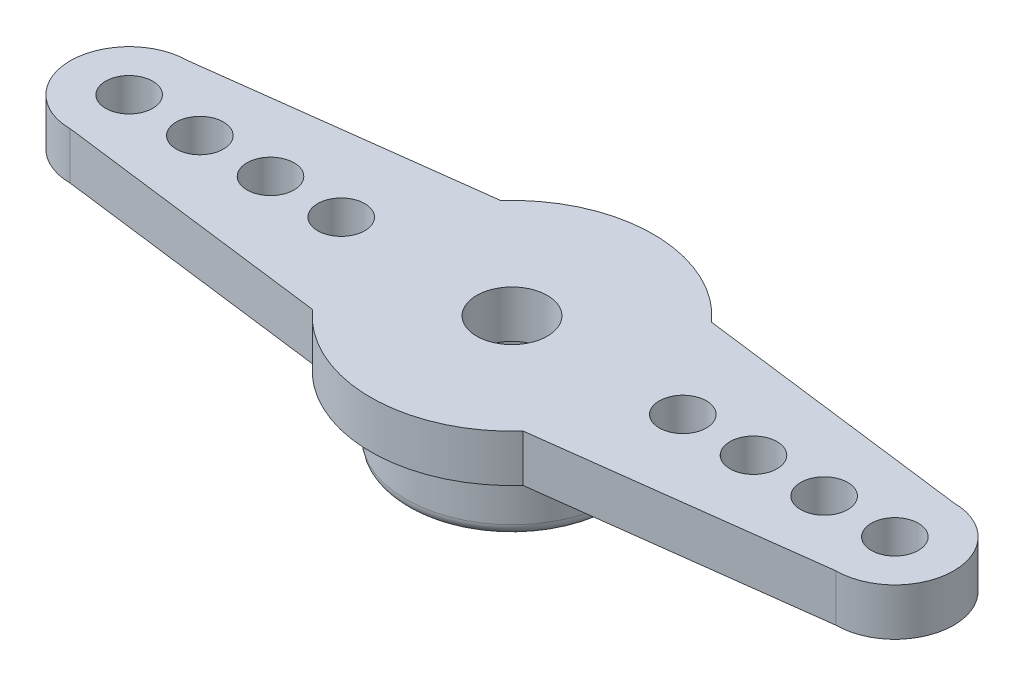
ISO-10303-21;
HEADER;
FILE_DESCRIPTION(('STEP AP214'),'2;1');
FILE_NAME('part.step','',(''),(''),'','','');
FILE_SCHEMA(('AUTOMOTIVE_DESIGN { 1 0 10303 214 1 1 1 1 }'));
ENDSEC;
DATA;
#1=APPLICATION_CONTEXT('core data for automotive mechanical design processes');
#2=APPLICATION_PROTOCOL_DEFINITION('international standard','automotive_design',2000,#1);
#3=PRODUCT_CONTEXT('',#1,'mechanical');
#4=PRODUCT('Part','Part','',(#3));
#5=PRODUCT_RELATED_PRODUCT_CATEGORY('part','',(#4));
#6=PRODUCT_DEFINITION_FORMATION('','',#4);
#7=PRODUCT_DEFINITION_CONTEXT('part definition',#1,'design');
#8=PRODUCT_DEFINITION('design','',#6,#7);
#9=PRODUCT_DEFINITION_SHAPE('','',#8);
#10=(LENGTH_UNIT() NAMED_UNIT(*) SI_UNIT(.MILLI.,.METRE.));
#11=(NAMED_UNIT(*) PLANE_ANGLE_UNIT() SI_UNIT($,.RADIAN.));
#12=(NAMED_UNIT(*) SI_UNIT($,.STERADIAN.) SOLID_ANGLE_UNIT());
#13=UNCERTAINTY_MEASURE_WITH_UNIT(LENGTH_MEASURE(1.E-05),#10,'distance_accuracy_value','');
#14=(GEOMETRIC_REPRESENTATION_CONTEXT(3) GLOBAL_UNCERTAINTY_ASSIGNED_CONTEXT((#13)) GLOBAL_UNIT_ASSIGNED_CONTEXT((#10,
#11,#12)) REPRESENTATION_CONTEXT('',''));
#15=CARTESIAN_POINT('',(0.,0.,0.));
#16=DIRECTION('',(0.,0.,1.));
#17=DIRECTION('',(1.,0.,0.));
#18=AXIS2_PLACEMENT_3D('',#15,#16,#17);
#19=CARTESIAN_POINT('',(0.,0.,0.));
#20=DIRECTION('',(0.,1.,0.));
#21=DIRECTION('',(0.,0.,1.));
#22=AXIS2_PLACEMENT_3D('',#19,#20,#21);
#23=PLANE('',#22);
#24=CARTESIAN_POINT('',(0.,0.,0.));
#25=DIRECTION('',(0.,1.,0.));
#26=DIRECTION('',(0.,0.,1.));
#27=AXIS2_PLACEMENT_3D('',#24,#25,#26);
#28=CIRCLE('',#27,1.5);
#29=CARTESIAN_POINT('',(0.,0.,1.5));
#30=VERTEX_POINT('',#29);
#31=EDGE_CURVE('E237',#30,#30,#28,.T.);
#32=ORIENTED_EDGE('',*,*,#31,.T.);
#33=EDGE_LOOP('',(#32));
#34=FACE_BOUND('',#33,.T.);
#35=CARTESIAN_POINT('',(0.,0.,0.));
#36=DIRECTION('',(0.,-1.,0.));
#37=DIRECTION('',(0.,0.,-1.));
#38=AXIS2_PLACEMENT_3D('',#35,#36,#37);
#39=CIRCLE('',#38,3.17956091615097);
#40=CARTESIAN_POINT('',(0.,0.,-3.17956091615097));
#41=VERTEX_POINT('',#40);
#42=EDGE_CURVE('E457',#41,#41,#39,.T.);
#43=ORIENTED_EDGE('',*,*,#42,.T.);
#44=EDGE_LOOP('',(#43));
#45=FACE_BOUND('',#44,.T.);
#46=ADVANCED_FACE('F33',(#34,#45),#23,.F.);
#47=CARTESIAN_POINT('',(0.,2.,0.));
#48=DIRECTION('',(0.,1.,0.));
#49=DIRECTION('',(0.,0.,1.));
#50=AXIS2_PLACEMENT_3D('',#47,#48,#49);
#51=PLANE('',#50);
#52=CARTESIAN_POINT('',(-7.25,2.,0.));
#53=DIRECTION('',(0.,1.,0.));
#54=DIRECTION('',(0.,0.,1.));
#55=AXIS2_PLACEMENT_3D('',#52,#53,#54);
#56=CIRCLE('',#55,1.);
#57=CARTESIAN_POINT('',(-7.25,2.,1.));
#58=VERTEX_POINT('',#57);
#59=EDGE_CURVE('E249',#58,#58,#56,.T.);
#60=ORIENTED_EDGE('',*,*,#59,.F.);
#61=EDGE_LOOP('',(#60));
#62=FACE_BOUND('',#61,.T.);
#63=CARTESIAN_POINT('',(0.,2.,0.));
#64=DIRECTION('',(0.,1.,0.));
#65=DIRECTION('',(0.,0.,1.));
#66=AXIS2_PLACEMENT_3D('',#63,#64,#65);
#67=CIRCLE('',#66,1.5);
#68=CARTESIAN_POINT('',(0.,2.,1.5));
#69=VERTEX_POINT('',#68);
#70=EDGE_CURVE('E479',#69,#69,#67,.T.);
#71=ORIENTED_EDGE('',*,*,#70,.F.);
#72=EDGE_LOOP('',(#71));
#73=FACE_BOUND('',#72,.T.);
#74=CARTESIAN_POINT('',(16.25,2.,0.));
#75=DIRECTION('',(0.,1.,0.));
#76=DIRECTION('',(0.,0.,1.));
#77=AXIS2_PLACEMENT_3D('',#74,#75,#76);
#78=CIRCLE('',#77,1.);
#79=CARTESIAN_POINT('',(16.25,2.,1.00000000000001));
#80=VERTEX_POINT('',#79);
#81=EDGE_CURVE('E234',#80,#80,#78,.F.);
#82=ORIENTED_EDGE('',*,*,#81,.T.);
#83=EDGE_LOOP('',(#82));
#84=FACE_BOUND('',#83,.T.);
#85=CARTESIAN_POINT('',(10.25,2.,0.));
#86=DIRECTION('',(0.,1.,0.));
#87=DIRECTION('',(0.,0.,1.));
#88=AXIS2_PLACEMENT_3D('',#85,#86,#87);
#89=CIRCLE('',#88,1.);
#90=CARTESIAN_POINT('',(10.25,2.,1.00000000000001));
#91=VERTEX_POINT('',#90);
#92=EDGE_CURVE('E244',#91,#91,#89,.F.);
#93=ORIENTED_EDGE('',*,*,#92,.T.);
#94=EDGE_LOOP('',(#93));
#95=FACE_BOUND('',#94,.T.);
#96=CARTESIAN_POINT('',(-10.25,2.,0.));
#97=DIRECTION('',(0.,1.,0.));
#98=DIRECTION('',(0.,0.,1.));
#99=AXIS2_PLACEMENT_3D('',#96,#97,#98);
#100=CIRCLE('',#99,1.);
#101=CARTESIAN_POINT('',(-10.25,2.,1.));
#102=VERTEX_POINT('',#101);
#103=EDGE_CURVE('E246',#102,#102,#100,.T.);
#104=ORIENTED_EDGE('',*,*,#103,.F.);
#105=EDGE_LOOP('',(#104));
#106=FACE_BOUND('',#105,.T.);
#107=CARTESIAN_POINT('',(0.,2.,0.));
#108=DIRECTION('',(0.,1.,0.));
#109=DIRECTION('',(0.,0.,1.));
#110=AXIS2_PLACEMENT_3D('',#107,#108,#109);
#111=CIRCLE('',#110,6.);
#112=CARTESIAN_POINT('',(4.47213595499958,2.,-4.));
#113=VERTEX_POINT('',#112);
#114=CARTESIAN_POINT('',(-4.47213595499958,2.,-4.));
#115=VERTEX_POINT('',#114);
#116=EDGE_CURVE('E147',#113,#115,#111,.T.);
#117=ORIENTED_EDGE('',*,*,#116,.T.);
#118=DIRECTION('',(-0.991987368893752,0.,0.126337088597339));
#119=VECTOR('',#118,1.);
#120=CARTESIAN_POINT('',(-16.25,2.,-2.5));
#121=LINE('',#120,#119);
#122=CARTESIAN_POINT('',(-16.25,2.,-2.5));
#123=VERTEX_POINT('',#122);
#124=EDGE_CURVE('E94',#115,#123,#121,.T.);
#125=ORIENTED_EDGE('',*,*,#124,.T.);
#126=CARTESIAN_POINT('',(-16.25,2.,0.));
#127=DIRECTION('',(0.,1.,0.));
#128=DIRECTION('',(0.,0.,1.));
#129=AXIS2_PLACEMENT_3D('',#126,#127,#128);
#130=CIRCLE('',#129,2.5);
#131=CARTESIAN_POINT('',(-16.25,2.,2.5));
#132=VERTEX_POINT('',#131);
#133=EDGE_CURVE('E252',#123,#132,#130,.T.);
#134=ORIENTED_EDGE('',*,*,#133,.T.);
#135=DIRECTION('',(0.991987368893752,0.,0.126337088597339));
#136=VECTOR('',#135,1.);
#137=CARTESIAN_POINT('',(-16.25,2.,2.5));
#138=LINE('',#137,#136);
#139=CARTESIAN_POINT('',(-4.47213595499958,2.,4.));
#140=VERTEX_POINT('',#139);
#141=EDGE_CURVE('E254',#132,#140,#138,.T.);
#142=ORIENTED_EDGE('',*,*,#141,.T.);
#143=CARTESIAN_POINT('',(0.,2.,0.));
#144=DIRECTION('',(0.,1.,0.));
#145=DIRECTION('',(0.,0.,1.));
#146=AXIS2_PLACEMENT_3D('',#143,#144,#145);
#147=CIRCLE('',#146,6.);
#148=CARTESIAN_POINT('',(4.47213595499958,2.,4.));
#149=VERTEX_POINT('',#148);
#150=EDGE_CURVE('E114',#140,#149,#147,.T.);
#151=ORIENTED_EDGE('',*,*,#150,.T.);
#152=DIRECTION('',(0.991987368893752,0.,-0.126337088597339));
#153=VECTOR('',#152,1.);
#154=CARTESIAN_POINT('',(4.47213595499958,2.,4.));
#155=LINE('',#154,#153);
#156=CARTESIAN_POINT('',(16.25,2.,2.5));
#157=VERTEX_POINT('',#156);
#158=EDGE_CURVE('E107',#149,#157,#155,.T.);
#159=ORIENTED_EDGE('',*,*,#158,.T.);
#160=CARTESIAN_POINT('',(16.25,2.,0.));
#161=DIRECTION('',(0.,1.,0.));
#162=DIRECTION('',(0.,0.,1.));
#163=AXIS2_PLACEMENT_3D('',#160,#161,#162);
#164=CIRCLE('',#163,2.5);
#165=CARTESIAN_POINT('',(16.25,2.,-2.5));
#166=VERTEX_POINT('',#165);
#167=EDGE_CURVE('E112',#157,#166,#164,.T.);
#168=ORIENTED_EDGE('',*,*,#167,.T.);
#169=DIRECTION('',(-0.991987368893752,0.,-0.126337088597339));
#170=VECTOR('',#169,1.);
#171=CARTESIAN_POINT('',(4.47213595499958,2.,-4.));
#172=LINE('',#171,#170);
#173=EDGE_CURVE('E50',#166,#113,#172,.T.);
#174=ORIENTED_EDGE('',*,*,#173,.T.);
#175=EDGE_LOOP('',(#117,#125,#134,#142,#151,#159,#168,#174));
#176=FACE_BOUND('',#175,.T.);
#177=CARTESIAN_POINT('',(-16.25,2.,0.));
#178=DIRECTION('',(0.,1.,0.));
#179=DIRECTION('',(0.,0.,1.));
#180=AXIS2_PLACEMENT_3D('',#177,#178,#179);
#181=CIRCLE('',#180,1.);
#182=CARTESIAN_POINT('',(-16.25,2.,1.));
#183=VERTEX_POINT('',#182);
#184=EDGE_CURVE('E472',#183,#183,#181,.T.);
#185=ORIENTED_EDGE('',*,*,#184,.F.);
#186=EDGE_LOOP('',(#185));
#187=FACE_BOUND('',#186,.T.);
#188=CARTESIAN_POINT('',(-13.25,2.,0.));
#189=DIRECTION('',(0.,1.,0.));
#190=DIRECTION('',(0.,0.,1.));
#191=AXIS2_PLACEMENT_3D('',#188,#189,#190);
#192=CIRCLE('',#191,1.);
#193=CARTESIAN_POINT('',(-13.25,2.,1.));
#194=VERTEX_POINT('',#193);
#195=EDGE_CURVE('E461',#194,#194,#192,.T.);
#196=ORIENTED_EDGE('',*,*,#195,.F.);
#197=EDGE_LOOP('',(#196));
#198=FACE_BOUND('',#197,.T.);
#199=CARTESIAN_POINT('',(7.25,2.,0.));
#200=DIRECTION('',(0.,-1.,0.));
#201=DIRECTION('',(0.,0.,-1.));
#202=AXIS2_PLACEMENT_3D('',#199,#200,#201);
#203=CIRCLE('',#202,1.);
#204=CARTESIAN_POINT('',(7.25,2.,-0.999999999999997));
#205=VERTEX_POINT('',#204);
#206=EDGE_CURVE('E465',#205,#205,#203,.T.);
#207=ORIENTED_EDGE('',*,*,#206,.T.);
#208=EDGE_LOOP('',(#207));
#209=FACE_BOUND('',#208,.T.);
#210=CARTESIAN_POINT('',(13.25,2.,0.));
#211=DIRECTION('',(0.,1.,0.));
#212=DIRECTION('',(0.,0.,1.));
#213=AXIS2_PLACEMENT_3D('',#210,#211,#212);
#214=CIRCLE('',#213,1.);
#215=CARTESIAN_POINT('',(13.25,2.,1.00000000000001));
#216=VERTEX_POINT('',#215);
#217=EDGE_CURVE('E233',#216,#216,#214,.F.);
#218=ORIENTED_EDGE('',*,*,#217,.T.);
#219=EDGE_LOOP('',(#218));
#220=FACE_BOUND('',#219,.T.);
#221=ADVANCED_FACE('F109',(#62,#73,#84,#95,#106,#176,#187,#198,#209,#220),#51,.T.);
#222=CARTESIAN_POINT('',(0.,0.,0.));
#223=DIRECTION('',(0.,1.,0.));
#224=DIRECTION('',(0.,0.,1.));
#225=AXIS2_PLACEMENT_3D('',#222,#223,#224);
#226=CIRCLE('',#225,4.5);
#227=CARTESIAN_POINT('',(0.,0.,4.5));
#228=VERTEX_POINT('',#227);
#229=EDGE_CURVE('E162',#228,#228,#226,.F.);
#230=ORIENTED_EDGE('',*,*,#229,.F.);
#231=EDGE_LOOP('',(#230));
#232=FACE_BOUND('',#231,.T.);
#233=CARTESIAN_POINT('',(-7.25,0.,0.));
#234=DIRECTION('',(0.,1.,0.));
#235=DIRECTION('',(0.,0.,1.));
#236=AXIS2_PLACEMENT_3D('',#233,#234,#235);
#237=CIRCLE('',#236,1.);
#238=CARTESIAN_POINT('',(-7.25,0.,1.));
#239=VERTEX_POINT('',#238);
#240=EDGE_CURVE('E203',#239,#239,#237,.T.);
#241=ORIENTED_EDGE('',*,*,#240,.T.);
#242=EDGE_LOOP('',(#241));
#243=FACE_BOUND('',#242,.T.);
#244=CARTESIAN_POINT('',(-13.25,0.,0.));
#245=DIRECTION('',(0.,1.,0.));
#246=DIRECTION('',(0.,0.,1.));
#247=AXIS2_PLACEMENT_3D('',#244,#245,#246);
#248=CIRCLE('',#247,1.);
#249=CARTESIAN_POINT('',(-13.25,0.,1.));
#250=VERTEX_POINT('',#249);
#251=EDGE_CURVE('E207',#250,#250,#248,.T.);
#252=ORIENTED_EDGE('',*,*,#251,.T.);
#253=EDGE_LOOP('',(#252));
#254=FACE_BOUND('',#253,.T.);
#255=CARTESIAN_POINT('',(-16.25,0.,0.));
#256=DIRECTION('',(0.,1.,0.));
#257=DIRECTION('',(0.,0.,1.));
#258=AXIS2_PLACEMENT_3D('',#255,#256,#257);
#259=CIRCLE('',#258,1.);
#260=CARTESIAN_POINT('',(-16.25,0.,1.));
#261=VERTEX_POINT('',#260);
#262=EDGE_CURVE('E211',#261,#261,#259,.T.);
#263=ORIENTED_EDGE('',*,*,#262,.T.);
#264=EDGE_LOOP('',(#263));
#265=FACE_BOUND('',#264,.T.);
#266=CARTESIAN_POINT('',(-10.25,0.,0.));
#267=DIRECTION('',(0.,1.,0.));
#268=DIRECTION('',(0.,0.,1.));
#269=AXIS2_PLACEMENT_3D('',#266,#267,#268);
#270=CIRCLE('',#269,1.);
#271=CARTESIAN_POINT('',(-10.25,0.,1.));
#272=VERTEX_POINT('',#271);
#273=EDGE_CURVE('E136',#272,#272,#270,.T.);
#274=ORIENTED_EDGE('',*,*,#273,.T.);
#275=EDGE_LOOP('',(#274));
#276=FACE_BOUND('',#275,.T.);
#277=CARTESIAN_POINT('',(0.,0.,0.));
#278=DIRECTION('',(0.,1.,0.));
#279=DIRECTION('',(0.,0.,1.));
#280=AXIS2_PLACEMENT_3D('',#277,#278,#279);
#281=CIRCLE('',#280,6.);
#282=CARTESIAN_POINT('',(4.47213595499958,0.,-4.));
#283=VERTEX_POINT('',#282);
#284=CARTESIAN_POINT('',(-4.47213595499958,0.,-4.));
#285=VERTEX_POINT('',#284);
#286=EDGE_CURVE('E132',#283,#285,#281,.T.);
#287=ORIENTED_EDGE('',*,*,#286,.F.);
#288=DIRECTION('',(-0.991987368893752,0.,-0.126337088597339));
#289=VECTOR('',#288,1.);
#290=CARTESIAN_POINT('',(4.47213595499958,0.,-4.));
#291=LINE('',#290,#289);
#292=CARTESIAN_POINT('',(16.25,0.,-2.5));
#293=VERTEX_POINT('',#292);
#294=EDGE_CURVE('E85',#293,#283,#291,.T.);
#295=ORIENTED_EDGE('',*,*,#294,.F.);
#296=CARTESIAN_POINT('',(16.25,0.,0.));
#297=DIRECTION('',(0.,1.,0.));
#298=DIRECTION('',(0.,0.,1.));
#299=AXIS2_PLACEMENT_3D('',#296,#297,#298);
#300=CIRCLE('',#299,2.5);
#301=CARTESIAN_POINT('',(16.25,0.,2.5));
#302=VERTEX_POINT('',#301);
#303=EDGE_CURVE('E79',#302,#293,#300,.T.);
#304=ORIENTED_EDGE('',*,*,#303,.F.);
#305=DIRECTION('',(0.991987368893752,0.,-0.126337088597339));
#306=VECTOR('',#305,1.);
#307=CARTESIAN_POINT('',(4.47213595499958,0.,4.));
#308=LINE('',#307,#306);
#309=CARTESIAN_POINT('',(4.47213595499958,0.,4.));
#310=VERTEX_POINT('',#309);
#311=EDGE_CURVE('E122',#310,#302,#308,.T.);
#312=ORIENTED_EDGE('',*,*,#311,.F.);
#313=CARTESIAN_POINT('',(0.,0.,0.));
#314=DIRECTION('',(0.,1.,0.));
#315=DIRECTION('',(0.,0.,1.));
#316=AXIS2_PLACEMENT_3D('',#313,#314,#315);
#317=CIRCLE('',#316,6.);
#318=CARTESIAN_POINT('',(-4.47213595499958,0.,4.));
#319=VERTEX_POINT('',#318);
#320=EDGE_CURVE('E142',#319,#310,#317,.T.);
#321=ORIENTED_EDGE('',*,*,#320,.F.);
#322=DIRECTION('',(0.991987368893752,0.,0.126337088597339));
#323=VECTOR('',#322,1.);
#324=CARTESIAN_POINT('',(-16.25,0.,2.5));
#325=LINE('',#324,#323);
#326=CARTESIAN_POINT('',(-16.25,0.,2.5));
#327=VERTEX_POINT('',#326);
#328=EDGE_CURVE('E140',#327,#319,#325,.T.);
#329=ORIENTED_EDGE('',*,*,#328,.F.);
#330=CARTESIAN_POINT('',(-16.25,0.,0.));
#331=DIRECTION('',(0.,1.,0.));
#332=DIRECTION('',(0.,0.,1.));
#333=AXIS2_PLACEMENT_3D('',#330,#331,#332);
#334=CIRCLE('',#333,2.5);
#335=CARTESIAN_POINT('',(-16.25,0.,-2.5));
#336=VERTEX_POINT('',#335);
#337=EDGE_CURVE('E138',#336,#327,#334,.T.);
#338=ORIENTED_EDGE('',*,*,#337,.F.);
#339=DIRECTION('',(-0.991987368893752,0.,0.126337088597339));
#340=VECTOR('',#339,1.);
#341=CARTESIAN_POINT('',(-16.25,0.,-2.5));
#342=LINE('',#341,#340);
#343=EDGE_CURVE('E135',#285,#336,#342,.T.);
#344=ORIENTED_EDGE('',*,*,#343,.F.);
#345=EDGE_LOOP('',(#287,#295,#304,#312,#321,#329,#338,#344));
#346=FACE_BOUND('',#345,.T.);
#347=CARTESIAN_POINT('',(10.25,0.,0.));
#348=DIRECTION('',(0.,1.,0.));
#349=DIRECTION('',(0.,0.,1.));
#350=AXIS2_PLACEMENT_3D('',#347,#348,#349);
#351=CIRCLE('',#350,1.);
#352=CARTESIAN_POINT('',(10.25,0.,1.00000000000001));
#353=VERTEX_POINT('',#352);
#354=EDGE_CURVE('E220',#353,#353,#351,.F.);
#355=ORIENTED_EDGE('',*,*,#354,.F.);
#356=EDGE_LOOP('',(#355));
#357=FACE_BOUND('',#356,.T.);
#358=CARTESIAN_POINT('',(7.25,0.,0.));
#359=DIRECTION('',(0.,-1.,0.));
#360=DIRECTION('',(0.,0.,-1.));
#361=AXIS2_PLACEMENT_3D('',#358,#359,#360);
#362=CIRCLE('',#361,1.);
#363=CARTESIAN_POINT('',(7.25,0.,-0.999999999999997));
#364=VERTEX_POINT('',#363);
#365=EDGE_CURVE('E224',#364,#364,#362,.T.);
#366=ORIENTED_EDGE('',*,*,#365,.F.);
#367=EDGE_LOOP('',(#366));
#368=FACE_BOUND('',#367,.T.);
#369=CARTESIAN_POINT('',(16.25,0.,0.));
#370=DIRECTION('',(0.,1.,0.));
#371=DIRECTION('',(0.,0.,1.));
#372=AXIS2_PLACEMENT_3D('',#369,#370,#371);
#373=CIRCLE('',#372,1.);
#374=CARTESIAN_POINT('',(16.25,0.,1.00000000000001));
#375=VERTEX_POINT('',#374);
#376=EDGE_CURVE('E228',#375,#375,#373,.F.);
#377=ORIENTED_EDGE('',*,*,#376,.F.);
#378=EDGE_LOOP('',(#377));
#379=FACE_BOUND('',#378,.T.);
#380=CARTESIAN_POINT('',(13.25,0.,0.));
#381=DIRECTION('',(0.,1.,0.));
#382=DIRECTION('',(0.,0.,1.));
#383=AXIS2_PLACEMENT_3D('',#380,#381,#382);
#384=CIRCLE('',#383,1.);
#385=CARTESIAN_POINT('',(13.25,0.,1.00000000000001));
#386=VERTEX_POINT('',#385);
#387=EDGE_CURVE('E231',#386,#386,#384,.F.);
#388=ORIENTED_EDGE('',*,*,#387,.F.);
#389=EDGE_LOOP('',(#388));
#390=FACE_BOUND('',#389,.T.);
#391=ADVANCED_FACE('F181',(#232,#243,#254,#265,#276,#346,#357,#368,#379,#390),#23,.F.);
#392=CARTESIAN_POINT('',(0.,2.,0.));
#393=DIRECTION('',(0.,-1.,0.));
#394=DIRECTION('',(0.,0.,-1.));
#395=AXIS2_PLACEMENT_3D('',#392,#393,#394);
#396=CYLINDRICAL_SURFACE('',#395,6.);
#397=ORIENTED_EDGE('',*,*,#286,.T.);
#398=DIRECTION('',(0.,-1.,0.));
#399=VECTOR('',#398,1.);
#400=CARTESIAN_POINT('',(-4.47213595499958,2.,-4.));
#401=LINE('',#400,#399);
#402=EDGE_CURVE('E160',#115,#285,#401,.T.);
#403=ORIENTED_EDGE('',*,*,#402,.F.);
#404=ORIENTED_EDGE('',*,*,#116,.F.);
#405=DIRECTION('',(0.,-1.,0.));
#406=VECTOR('',#405,1.);
#407=CARTESIAN_POINT('',(4.47213595499958,2.,-4.));
#408=LINE('',#407,#406);
#409=EDGE_CURVE('E128',#113,#283,#408,.T.);
#410=ORIENTED_EDGE('',*,*,#409,.T.);
#411=EDGE_LOOP('',(#397,#403,#404,#410));
#412=FACE_BOUND('',#411,.T.);
#413=ADVANCED_FACE('F191',(#412),#396,.T.);
#414=CARTESIAN_POINT('',(-16.25,2.,-2.5));
#415=DIRECTION('',(0.126337088597339,0.,0.991987368893752));
#416=DIRECTION('',(0.991987368893752,0.,-0.126337088597339));
#417=AXIS2_PLACEMENT_3D('',#414,#415,#416);
#418=PLANE('',#417);
#419=ORIENTED_EDGE('',*,*,#343,.T.);
#420=DIRECTION('',(0.,-1.,0.));
#421=VECTOR('',#420,1.);
#422=CARTESIAN_POINT('',(-16.25,2.,-2.5));
#423=LINE('',#422,#421);
#424=EDGE_CURVE('E157',#123,#336,#423,.T.);
#425=ORIENTED_EDGE('',*,*,#424,.F.);
#426=ORIENTED_EDGE('',*,*,#124,.F.);
#427=ORIENTED_EDGE('',*,*,#402,.T.);
#428=EDGE_LOOP('',(#419,#425,#426,#427));
#429=FACE_BOUND('',#428,.T.);
#430=ADVANCED_FACE('F196',(#429),#418,.F.);
#431=CARTESIAN_POINT('',(-16.25,2.,0.));
#432=DIRECTION('',(0.,-1.,0.));
#433=DIRECTION('',(0.,0.,-1.));
#434=AXIS2_PLACEMENT_3D('',#431,#432,#433);
#435=CYLINDRICAL_SURFACE('',#434,2.5);
#436=ORIENTED_EDGE('',*,*,#337,.T.);
#437=DIRECTION('',(0.,-1.,0.));
#438=VECTOR('',#437,1.);
#439=CARTESIAN_POINT('',(-16.25,2.,2.5));
#440=LINE('',#439,#438);
#441=EDGE_CURVE('E154',#132,#327,#440,.T.);
#442=ORIENTED_EDGE('',*,*,#441,.F.);
#443=ORIENTED_EDGE('',*,*,#133,.F.);
#444=ORIENTED_EDGE('',*,*,#424,.T.);
#445=EDGE_LOOP('',(#436,#442,#443,#444));
#446=FACE_BOUND('',#445,.T.);
#447=ADVANCED_FACE('F267',(#446),#435,.T.);
#448=CARTESIAN_POINT('',(-16.25,2.,2.5));
#449=DIRECTION('',(0.126337088597339,0.,-0.991987368893752));
#450=DIRECTION('',(-0.991987368893752,0.,-0.126337088597339));
#451=AXIS2_PLACEMENT_3D('',#448,#449,#450);
#452=PLANE('',#451);
#453=ORIENTED_EDGE('',*,*,#328,.T.);
#454=DIRECTION('',(0.,-1.,0.));
#455=VECTOR('',#454,1.);
#456=CARTESIAN_POINT('',(-4.47213595499958,2.,4.));
#457=LINE('',#456,#455);
#458=EDGE_CURVE('E151',#140,#319,#457,.T.);
#459=ORIENTED_EDGE('',*,*,#458,.F.);
#460=ORIENTED_EDGE('',*,*,#141,.F.);
#461=ORIENTED_EDGE('',*,*,#441,.T.);
#462=EDGE_LOOP('',(#453,#459,#460,#461));
#463=FACE_BOUND('',#462,.T.);
#464=ADVANCED_FACE('F260',(#463),#452,.F.);
#465=CARTESIAN_POINT('',(0.,2.,0.));
#466=DIRECTION('',(0.,-1.,0.));
#467=DIRECTION('',(0.,0.,-1.));
#468=AXIS2_PLACEMENT_3D('',#465,#466,#467);
#469=CYLINDRICAL_SURFACE('',#468,6.);
#470=ORIENTED_EDGE('',*,*,#320,.T.);
#471=DIRECTION('',(0.,-1.,0.));
#472=VECTOR('',#471,1.);
#473=CARTESIAN_POINT('',(4.47213595499958,2.,4.));
#474=LINE('',#473,#472);
#475=EDGE_CURVE('E123',#149,#310,#474,.T.);
#476=ORIENTED_EDGE('',*,*,#475,.F.);
#477=ORIENTED_EDGE('',*,*,#150,.F.);
#478=ORIENTED_EDGE('',*,*,#458,.T.);
#479=EDGE_LOOP('',(#470,#476,#477,#478));
#480=FACE_BOUND('',#479,.T.);
#481=ADVANCED_FACE('F264',(#480),#469,.T.);
#482=CARTESIAN_POINT('',(4.47213595499958,2.,4.));
#483=DIRECTION('',(-0.126337088597339,0.,-0.991987368893752));
#484=DIRECTION('',(-0.991987368893752,0.,0.126337088597339));
#485=AXIS2_PLACEMENT_3D('',#482,#483,#484);
#486=PLANE('',#485);
#487=ORIENTED_EDGE('',*,*,#311,.T.);
#488=DIRECTION('',(0.,-1.,0.));
#489=VECTOR('',#488,1.);
#490=CARTESIAN_POINT('',(16.25,2.,2.5));
#491=LINE('',#490,#489);
#492=EDGE_CURVE('E119',#157,#302,#491,.T.);
#493=ORIENTED_EDGE('',*,*,#492,.F.);
#494=ORIENTED_EDGE('',*,*,#158,.F.);
#495=ORIENTED_EDGE('',*,*,#475,.T.);
#496=EDGE_LOOP('',(#487,#493,#494,#495));
#497=FACE_BOUND('',#496,.T.);
#498=ADVANCED_FACE('F120',(#497),#486,.F.);
#499=CARTESIAN_POINT('',(16.25,2.,0.));
#500=DIRECTION('',(0.,-1.,0.));
#501=DIRECTION('',(0.,0.,-1.));
#502=AXIS2_PLACEMENT_3D('',#499,#500,#501);
#503=CYLINDRICAL_SURFACE('',#502,2.5);
#504=ORIENTED_EDGE('',*,*,#303,.T.);
#505=DIRECTION('',(0.,-1.,0.));
#506=VECTOR('',#505,1.);
#507=CARTESIAN_POINT('',(16.25,2.,-2.5));
#508=LINE('',#507,#506);
#509=EDGE_CURVE('E124',#166,#293,#508,.T.);
#510=ORIENTED_EDGE('',*,*,#509,.F.);
#511=ORIENTED_EDGE('',*,*,#167,.F.);
#512=ORIENTED_EDGE('',*,*,#492,.T.);
#513=EDGE_LOOP('',(#504,#510,#511,#512));
#514=FACE_BOUND('',#513,.T.);
#515=ADVANCED_FACE('F126',(#514),#503,.T.);
#516=CARTESIAN_POINT('',(4.47213595499958,2.,-4.));
#517=DIRECTION('',(-0.126337088597339,0.,0.991987368893752));
#518=DIRECTION('',(0.991987368893752,0.,0.126337088597339));
#519=AXIS2_PLACEMENT_3D('',#516,#517,#518);
#520=PLANE('',#519);
#521=ORIENTED_EDGE('',*,*,#294,.T.);
#522=ORIENTED_EDGE('',*,*,#409,.F.);
#523=ORIENTED_EDGE('',*,*,#173,.F.);
#524=ORIENTED_EDGE('',*,*,#509,.T.);
#525=EDGE_LOOP('',(#521,#522,#523,#524));
#526=FACE_BOUND('',#525,.T.);
#527=ADVANCED_FACE('F270',(#526),#520,.F.);
#528=CARTESIAN_POINT('',(-10.25,0.,0.));
#529=DIRECTION('',(0.,1.,0.));
#530=DIRECTION('',(0.,0.,1.));
#531=AXIS2_PLACEMENT_3D('',#528,#529,#530);
#532=CYLINDRICAL_SURFACE('',#531,1.);
#533=ORIENTED_EDGE('',*,*,#273,.F.);
#534=EDGE_LOOP('',(#533));
#535=FACE_BOUND('',#534,.T.);
#536=ORIENTED_EDGE('',*,*,#103,.T.);
#537=EDGE_LOOP('',(#536));
#538=FACE_BOUND('',#537,.T.);
#539=ADVANCED_FACE('F272',(#535,#538),#532,.F.);
#540=CARTESIAN_POINT('',(10.25,0.,0.));
#541=DIRECTION('',(0.,1.,0.));
#542=DIRECTION('',(0.,0.,1.));
#543=AXIS2_PLACEMENT_3D('',#540,#541,#542);
#544=CYLINDRICAL_SURFACE('',#543,1.);
#545=ORIENTED_EDGE('',*,*,#354,.T.);
#546=EDGE_LOOP('',(#545));
#547=FACE_BOUND('',#546,.T.);
#548=ORIENTED_EDGE('',*,*,#92,.F.);
#549=EDGE_LOOP('',(#548));
#550=FACE_BOUND('',#549,.T.);
#551=ADVANCED_FACE('F277',(#547,#550),#544,.F.);
#552=CARTESIAN_POINT('',(-16.25,0.,0.));
#553=DIRECTION('',(0.,1.,0.));
#554=DIRECTION('',(0.,0.,1.));
#555=AXIS2_PLACEMENT_3D('',#552,#553,#554);
#556=CYLINDRICAL_SURFACE('',#555,1.);
#557=ORIENTED_EDGE('',*,*,#262,.F.);
#558=EDGE_LOOP('',(#557));
#559=FACE_BOUND('',#558,.T.);
#560=ORIENTED_EDGE('',*,*,#184,.T.);
#561=EDGE_LOOP('',(#560));
#562=FACE_BOUND('',#561,.T.);
#563=ADVANCED_FACE('F341',(#559,#562),#556,.F.);
#564=CARTESIAN_POINT('',(-13.25,0.,0.));
#565=DIRECTION('',(0.,1.,0.));
#566=DIRECTION('',(0.,0.,1.));
#567=AXIS2_PLACEMENT_3D('',#564,#565,#566);
#568=CYLINDRICAL_SURFACE('',#567,1.);
#569=ORIENTED_EDGE('',*,*,#251,.F.);
#570=EDGE_LOOP('',(#569));
#571=FACE_BOUND('',#570,.T.);
#572=ORIENTED_EDGE('',*,*,#195,.T.);
#573=EDGE_LOOP('',(#572));
#574=FACE_BOUND('',#573,.T.);
#575=ADVANCED_FACE('F351',(#571,#574),#568,.F.);
#576=CARTESIAN_POINT('',(7.25,0.,0.));
#577=DIRECTION('',(0.,1.,0.));
#578=DIRECTION('',(0.,0.,1.));
#579=AXIS2_PLACEMENT_3D('',#576,#577,#578);
#580=CYLINDRICAL_SURFACE('',#579,1.);
#581=ORIENTED_EDGE('',*,*,#365,.T.);
#582=EDGE_LOOP('',(#581));
#583=FACE_BOUND('',#582,.T.);
#584=ORIENTED_EDGE('',*,*,#206,.F.);
#585=EDGE_LOOP('',(#584));
#586=FACE_BOUND('',#585,.T.);
#587=ADVANCED_FACE('F361',(#583,#586),#580,.F.);
#588=CARTESIAN_POINT('',(16.25,0.,0.));
#589=DIRECTION('',(0.,1.,0.));
#590=DIRECTION('',(0.,0.,1.));
#591=AXIS2_PLACEMENT_3D('',#588,#589,#590);
#592=CYLINDRICAL_SURFACE('',#591,1.);
#593=ORIENTED_EDGE('',*,*,#376,.T.);
#594=EDGE_LOOP('',(#593));
#595=FACE_BOUND('',#594,.T.);
#596=ORIENTED_EDGE('',*,*,#81,.F.);
#597=EDGE_LOOP('',(#596));
#598=FACE_BOUND('',#597,.T.);
#599=ADVANCED_FACE('F371',(#595,#598),#592,.F.);
#600=CARTESIAN_POINT('',(13.25,0.,0.));
#601=DIRECTION('',(0.,1.,0.));
#602=DIRECTION('',(0.,0.,1.));
#603=AXIS2_PLACEMENT_3D('',#600,#601,#602);
#604=CYLINDRICAL_SURFACE('',#603,1.);
#605=ORIENTED_EDGE('',*,*,#387,.T.);
#606=EDGE_LOOP('',(#605));
#607=FACE_BOUND('',#606,.T.);
#608=ORIENTED_EDGE('',*,*,#217,.F.);
#609=EDGE_LOOP('',(#608));
#610=FACE_BOUND('',#609,.T.);
#611=ADVANCED_FACE('F381',(#607,#610),#604,.F.);
#612=CARTESIAN_POINT('',(0.,0.,0.));
#613=DIRECTION('',(0.,1.,0.));
#614=DIRECTION('',(0.,0.,1.));
#615=AXIS2_PLACEMENT_3D('',#612,#613,#614);
#616=CYLINDRICAL_SURFACE('',#615,1.5);
#617=ORIENTED_EDGE('',*,*,#31,.F.);
#618=EDGE_LOOP('',(#617));
#619=FACE_BOUND('',#618,.T.);
#620=ORIENTED_EDGE('',*,*,#70,.T.);
#621=EDGE_LOOP('',(#620));
#622=FACE_BOUND('',#621,.T.);
#623=ADVANCED_FACE('F391',(#619,#622),#616,.F.);
#624=CARTESIAN_POINT('',(-7.25,0.,0.));
#625=DIRECTION('',(0.,1.,0.));
#626=DIRECTION('',(0.,0.,1.));
#627=AXIS2_PLACEMENT_3D('',#624,#625,#626);
#628=CYLINDRICAL_SURFACE('',#627,1.);
#629=ORIENTED_EDGE('',*,*,#240,.F.);
#630=EDGE_LOOP('',(#629));
#631=FACE_BOUND('',#630,.T.);
#632=ORIENTED_EDGE('',*,*,#59,.T.);
#633=EDGE_LOOP('',(#632));
#634=FACE_BOUND('',#633,.T.);
#635=ADVANCED_FACE('F400',(#631,#634),#628,.F.);
#636=CARTESIAN_POINT('',(0.,-3.,0.));
#637=DIRECTION('',(0.,1.,0.));
#638=DIRECTION('',(0.,0.,1.));
#639=AXIS2_PLACEMENT_3D('',#636,#637,#638);
#640=CYLINDRICAL_SURFACE('',#639,3.17956091615097);
#641=CARTESIAN_POINT('',(0.,-3.,0.));
#642=DIRECTION('',(0.,-1.,0.));
#643=DIRECTION('',(0.,0.,-1.));
#644=AXIS2_PLACEMENT_3D('',#641,#642,#643);
#645=CIRCLE('',#644,3.17956091615097);
#646=CARTESIAN_POINT('',(0.,-3.,-3.17956091615097));
#647=VERTEX_POINT('',#646);
#648=EDGE_CURVE('E454',#647,#647,#645,.T.);
#649=ORIENTED_EDGE('',*,*,#648,.T.);
#650=EDGE_LOOP('',(#649));
#651=FACE_BOUND('',#650,.T.);
#652=ORIENTED_EDGE('',*,*,#42,.F.);
#653=EDGE_LOOP('',(#652));
#654=FACE_BOUND('',#653,.T.);
#655=ADVANCED_FACE('F409',(#651,#654),#640,.F.);
#656=CARTESIAN_POINT('',(0.,-3.,0.));
#657=DIRECTION('',(0.,1.,0.));
#658=DIRECTION('',(0.,0.,1.));
#659=AXIS2_PLACEMENT_3D('',#656,#657,#658);
#660=CYLINDRICAL_SURFACE('',#659,4.5);
#661=CARTESIAN_POINT('',(0.,-2.5,0.));
#662=DIRECTION('',(0.,-1.,0.));
#663=DIRECTION('',(0.,0.,-1.));
#664=AXIS2_PLACEMENT_3D('',#661,#662,#663);
#665=CIRCLE('',#664,4.5);
#666=CARTESIAN_POINT('',(0.,-2.5,-4.5));
#667=VERTEX_POINT('',#666);
#668=EDGE_CURVE('E11',#667,#667,#665,.F.);
#669=ORIENTED_EDGE('',*,*,#668,.T.);
#670=EDGE_LOOP('',(#669));
#671=FACE_BOUND('',#670,.T.);
#672=ORIENTED_EDGE('',*,*,#229,.T.);
#673=EDGE_LOOP('',(#672));
#674=FACE_BOUND('',#673,.T.);
#675=ADVANCED_FACE('F175',(#671,#674),#660,.T.);
#676=CARTESIAN_POINT('',(0.,-3.,0.));
#677=DIRECTION('',(0.,-1.,0.));
#678=DIRECTION('',(0.,0.,-1.));
#679=AXIS2_PLACEMENT_3D('',#676,#677,#678);
#680=PLANE('',#679);
#681=CARTESIAN_POINT('',(0.,-3.,0.));
#682=DIRECTION('',(0.,-1.,0.));
#683=DIRECTION('',(0.,0.,-1.));
#684=AXIS2_PLACEMENT_3D('',#681,#682,#683);
#685=CIRCLE('',#684,4.);
#686=CARTESIAN_POINT('',(0.,-3.,-4.));
#687=VERTEX_POINT('',#686);
#688=EDGE_CURVE('E42',#687,#687,#685,.T.);
#689=ORIENTED_EDGE('',*,*,#688,.T.);
#690=EDGE_LOOP('',(#689));
#691=FACE_BOUND('',#690,.T.);
#692=ORIENTED_EDGE('',*,*,#648,.F.);
#693=EDGE_LOOP('',(#692));
#694=FACE_BOUND('',#693,.T.);
#695=ADVANCED_FACE('F167',(#691,#694),#680,.T.);
#696=CARTESIAN_POINT('',(0.,-2.5,0.));
#697=DIRECTION('',(0.,-1.,0.));
#698=DIRECTION('',(0.,0.,-1.));
#699=AXIS2_PLACEMENT_3D('',#696,#697,#698);
#700=TOROIDAL_SURFACE('',#699,4.,0.5);
#701=ORIENTED_EDGE('',*,*,#668,.F.);
#702=EDGE_LOOP('',(#701));
#703=FACE_BOUND('',#702,.T.);
#704=ORIENTED_EDGE('',*,*,#688,.F.);
#705=EDGE_LOOP('',(#704));
#706=FACE_BOUND('',#705,.T.);
#707=ADVANCED_FACE('F35',(#703,#706),#700,.T.);
#708=CLOSED_SHELL('',(#46,#221,#391,#413,#430,#447,#464,#481,#498,#515,#527,#539,#551,#563,#575,
#587,#599,#611,#623,#635,#655,#675,#695,#707));
#709=MANIFOLD_SOLID_BREP('B2',#708);
#710=ADVANCED_BREP_SHAPE_REPRESENTATION('',(#18,#709),#14);
#711=SHAPE_DEFINITION_REPRESENTATION(#9,#710);
ENDSEC;
END-ISO-10303-21;
